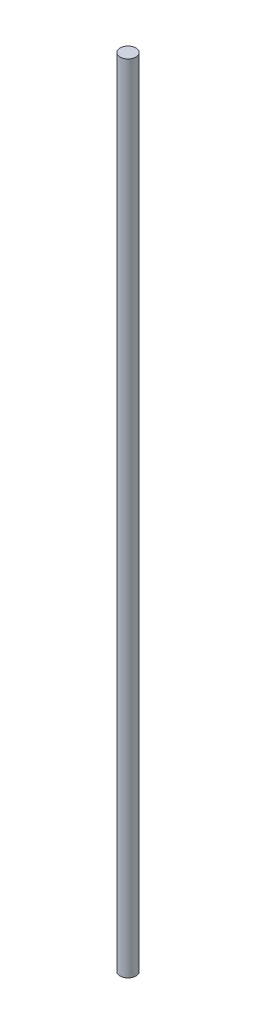
ISO-10303-21;
HEADER;
FILE_DESCRIPTION(('STEP AP214'),'2;1');
FILE_NAME('part.step','',(''),(''),'','','');
FILE_SCHEMA(('AUTOMOTIVE_DESIGN { 1 0 10303 214 1 1 1 1 }'));
ENDSEC;
DATA;
#1=APPLICATION_CONTEXT('core data for automotive mechanical design processes');
#2=APPLICATION_PROTOCOL_DEFINITION('international standard','automotive_design',2000,#1);
#3=PRODUCT_CONTEXT('',#1,'mechanical');
#4=PRODUCT('Part','Part','',(#3));
#5=PRODUCT_RELATED_PRODUCT_CATEGORY('part','',(#4));
#6=PRODUCT_DEFINITION_FORMATION('','',#4);
#7=PRODUCT_DEFINITION_CONTEXT('part definition',#1,'design');
#8=PRODUCT_DEFINITION('design','',#6,#7);
#9=PRODUCT_DEFINITION_SHAPE('','',#8);
#10=(LENGTH_UNIT() NAMED_UNIT(*) SI_UNIT(.MILLI.,.METRE.));
#11=(NAMED_UNIT(*) PLANE_ANGLE_UNIT() SI_UNIT($,.RADIAN.));
#12=(NAMED_UNIT(*) SI_UNIT($,.STERADIAN.) SOLID_ANGLE_UNIT());
#13=UNCERTAINTY_MEASURE_WITH_UNIT(LENGTH_MEASURE(1.E-05),#10,'distance_accuracy_value','');
#14=(GEOMETRIC_REPRESENTATION_CONTEXT(3) GLOBAL_UNCERTAINTY_ASSIGNED_CONTEXT((#13)) GLOBAL_UNIT_ASSIGNED_CONTEXT((#10,
#11,#12)) REPRESENTATION_CONTEXT('',''));
#15=CARTESIAN_POINT('',(0.,0.,0.));
#16=DIRECTION('',(0.,0.,1.));
#17=DIRECTION('',(1.,0.,0.));
#18=AXIS2_PLACEMENT_3D('',#15,#16,#17);
#19=CARTESIAN_POINT('',(-18.9389897483923,100.,-21.6064530932363));
#20=DIRECTION('',(0.,-1.,0.));
#21=DIRECTION('',(0.,0.,-1.));
#22=AXIS2_PLACEMENT_3D('',#19,#20,#21);
#23=CYLINDRICAL_SURFACE('',#22,1.);
#24=CARTESIAN_POINT('',(-18.9389897483923,100.,-21.6064530932363));
#25=DIRECTION('',(0.,1.,0.));
#26=DIRECTION('',(0.,0.,1.));
#27=AXIS2_PLACEMENT_3D('',#24,#25,#26);
#28=CIRCLE('',#27,1.);
#29=CARTESIAN_POINT('',(-18.9389897483923,100.,-20.6064530932363));
#30=VERTEX_POINT('',#29);
#31=EDGE_CURVE('E10',#30,#30,#28,.T.);
#32=ORIENTED_EDGE('',*,*,#31,.F.);
#33=EDGE_LOOP('',(#32));
#34=FACE_BOUND('',#33,.T.);
#35=CARTESIAN_POINT('',(-18.9389897483923,0.,-21.6064530932363));
#36=DIRECTION('',(0.,1.,0.));
#37=DIRECTION('',(0.,0.,1.));
#38=AXIS2_PLACEMENT_3D('',#35,#36,#37);
#39=CIRCLE('',#38,1.);
#40=CARTESIAN_POINT('',(-18.9389897483923,0.,-20.6064530932363));
#41=VERTEX_POINT('',#40);
#42=EDGE_CURVE('E33',#41,#41,#39,.T.);
#43=ORIENTED_EDGE('',*,*,#42,.T.);
#44=EDGE_LOOP('',(#43));
#45=FACE_BOUND('',#44,.T.);
#46=ADVANCED_FACE('F30',(#34,#45),#23,.T.);
#47=CARTESIAN_POINT('',(-18.9389897483923,100.,-21.6064530932363));
#48=DIRECTION('',(0.,1.,0.));
#49=DIRECTION('',(0.,0.,1.));
#50=AXIS2_PLACEMENT_3D('',#47,#48,#49);
#51=PLANE('',#50);
#52=ORIENTED_EDGE('',*,*,#31,.T.);
#53=EDGE_LOOP('',(#52));
#54=FACE_BOUND('',#53,.T.);
#55=ADVANCED_FACE('F45',(#54),#51,.T.);
#56=CARTESIAN_POINT('',(-18.9389897483923,0.,-21.6064530932363));
#57=DIRECTION('',(0.,1.,0.));
#58=DIRECTION('',(0.,0.,1.));
#59=AXIS2_PLACEMENT_3D('',#56,#57,#58);
#60=PLANE('',#59);
#61=ORIENTED_EDGE('',*,*,#42,.F.);
#62=EDGE_LOOP('',(#61));
#63=FACE_BOUND('',#62,.T.);
#64=ADVANCED_FACE('F43',(#63),#60,.F.);
#65=CLOSED_SHELL('',(#46,#55,#64));
#66=MANIFOLD_SOLID_BREP('B2',#65);
#67=ADVANCED_BREP_SHAPE_REPRESENTATION('',(#18,#66),#14);
#68=SHAPE_DEFINITION_REPRESENTATION(#9,#67);
ENDSEC;
END-ISO-10303-21;
